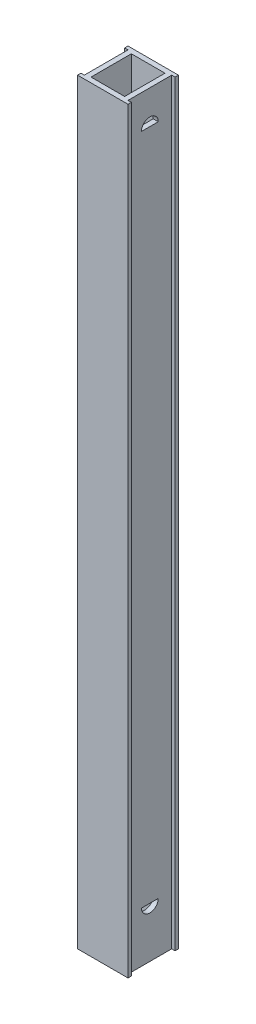
ISO-10303-21;
HEADER;
FILE_DESCRIPTION(('STEP AP214'),'2;1');
FILE_NAME('part.step','',(''),(''),'','','');
FILE_SCHEMA(('AUTOMOTIVE_DESIGN { 1 0 10303 214 1 1 1 1 }'));
ENDSEC;
DATA;
#1=APPLICATION_CONTEXT('core data for automotive mechanical design processes');
#2=APPLICATION_PROTOCOL_DEFINITION('international standard','automotive_design',2000,#1);
#3=PRODUCT_CONTEXT('',#1,'mechanical');
#4=PRODUCT('Part','Part','',(#3));
#5=PRODUCT_RELATED_PRODUCT_CATEGORY('part','',(#4));
#6=PRODUCT_DEFINITION_FORMATION('','',#4);
#7=PRODUCT_DEFINITION_CONTEXT('part definition',#1,'design');
#8=PRODUCT_DEFINITION('design','',#6,#7);
#9=PRODUCT_DEFINITION_SHAPE('','',#8);
#10=(LENGTH_UNIT() NAMED_UNIT(*) SI_UNIT(.MILLI.,.METRE.));
#11=(NAMED_UNIT(*) PLANE_ANGLE_UNIT() SI_UNIT($,.RADIAN.));
#12=(NAMED_UNIT(*) SI_UNIT($,.STERADIAN.) SOLID_ANGLE_UNIT());
#13=UNCERTAINTY_MEASURE_WITH_UNIT(LENGTH_MEASURE(1.E-05),#10,'distance_accuracy_value','');
#14=(GEOMETRIC_REPRESENTATION_CONTEXT(3) GLOBAL_UNCERTAINTY_ASSIGNED_CONTEXT((#13)) GLOBAL_UNIT_ASSIGNED_CONTEXT((#10,
#11,#12)) REPRESENTATION_CONTEXT('',''));
#15=CARTESIAN_POINT('',(0.,0.,0.));
#16=DIRECTION('',(0.,0.,1.));
#17=DIRECTION('',(1.,0.,0.));
#18=AXIS2_PLACEMENT_3D('',#15,#16,#17);
#19=CARTESIAN_POINT('',(-15.,225.,30.));
#20=DIRECTION('',(0.,-1.,0.));
#21=DIRECTION('',(0.,0.,-1.));
#22=AXIS2_PLACEMENT_3D('',#19,#20,#21);
#23=PLANE('',#22);
#24=DIRECTION('',(0.,0.,-1.));
#25=VECTOR('',#24,1.);
#26=CARTESIAN_POINT('',(-15.,225.,30.));
#27=LINE('',#26,#25);
#28=CARTESIAN_POINT('',(-15.,225.,2.));
#29=VERTEX_POINT('',#28);
#30=CARTESIAN_POINT('',(-15.,225.,0.));
#31=VERTEX_POINT('',#30);
#32=EDGE_CURVE('E349',#29,#31,#27,.T.);
#33=ORIENTED_EDGE('',*,*,#32,.F.);
#34=DIRECTION('',(-1.,0.,0.));
#35=VECTOR('',#34,1.);
#36=CARTESIAN_POINT('',(-15.,225.,2.));
#37=LINE('',#36,#35);
#38=CARTESIAN_POINT('',(-13.,225.,2.));
#39=VERTEX_POINT('',#38);
#40=EDGE_CURVE('E291',#39,#29,#37,.T.);
#41=ORIENTED_EDGE('',*,*,#40,.F.);
#42=DIRECTION('',(0.,0.,-1.));
#43=VECTOR('',#42,1.);
#44=CARTESIAN_POINT('',(-13.,225.,2.));
#45=LINE('',#44,#43);
#46=CARTESIAN_POINT('',(-13.,225.,28.));
#47=VERTEX_POINT('',#46);
#48=EDGE_CURVE('E301',#47,#39,#45,.T.);
#49=ORIENTED_EDGE('',*,*,#48,.F.);
#50=DIRECTION('',(1.,0.,0.));
#51=VECTOR('',#50,1.);
#52=CARTESIAN_POINT('',(-13.,225.,28.));
#53=LINE('',#52,#51);
#54=CARTESIAN_POINT('',(-15.,225.,28.));
#55=VERTEX_POINT('',#54);
#56=EDGE_CURVE('E298',#55,#47,#53,.T.);
#57=ORIENTED_EDGE('',*,*,#56,.F.);
#58=CARTESIAN_POINT('',(-15.,225.,30.));
#59=VERTEX_POINT('',#58);
#60=EDGE_CURVE('E360',#59,#55,#27,.T.);
#61=ORIENTED_EDGE('',*,*,#60,.F.);
#62=DIRECTION('',(-1.,0.,0.));
#63=VECTOR('',#62,1.);
#64=CARTESIAN_POINT('',(-15.,225.,30.));
#65=LINE('',#64,#63);
#66=CARTESIAN_POINT('',(15.,225.,30.));
#67=VERTEX_POINT('',#66);
#68=EDGE_CURVE('E347',#67,#59,#65,.T.);
#69=ORIENTED_EDGE('',*,*,#68,.F.);
#70=DIRECTION('',(0.,0.,-1.));
#71=VECTOR('',#70,1.);
#72=CARTESIAN_POINT('',(15.,225.,30.));
#73=LINE('',#72,#71);
#74=CARTESIAN_POINT('',(15.,225.,28.));
#75=VERTEX_POINT('',#74);
#76=EDGE_CURVE('E364',#67,#75,#73,.T.);
#77=ORIENTED_EDGE('',*,*,#76,.T.);
#78=DIRECTION('',(1.,0.,0.));
#79=VECTOR('',#78,1.);
#80=CARTESIAN_POINT('',(13.,225.,28.));
#81=LINE('',#80,#79);
#82=CARTESIAN_POINT('',(13.,225.,28.));
#83=VERTEX_POINT('',#82);
#84=EDGE_CURVE('E328',#83,#75,#81,.T.);
#85=ORIENTED_EDGE('',*,*,#84,.F.);
#86=DIRECTION('',(0.,0.,1.));
#87=VECTOR('',#86,1.);
#88=CARTESIAN_POINT('',(13.,225.,2.));
#89=LINE('',#88,#87);
#90=CARTESIAN_POINT('',(13.,225.,2.));
#91=VERTEX_POINT('',#90);
#92=EDGE_CURVE('E302',#91,#83,#89,.T.);
#93=ORIENTED_EDGE('',*,*,#92,.F.);
#94=DIRECTION('',(-1.,0.,0.));
#95=VECTOR('',#94,1.);
#96=CARTESIAN_POINT('',(15.,225.,2.));
#97=LINE('',#96,#95);
#98=CARTESIAN_POINT('',(15.,225.,2.));
#99=VERTEX_POINT('',#98);
#100=EDGE_CURVE('E325',#99,#91,#97,.T.);
#101=ORIENTED_EDGE('',*,*,#100,.F.);
#102=CARTESIAN_POINT('',(15.,225.,0.));
#103=VERTEX_POINT('',#102);
#104=EDGE_CURVE('E363',#99,#103,#73,.T.);
#105=ORIENTED_EDGE('',*,*,#104,.T.);
#106=DIRECTION('',(-1.,0.,0.));
#107=VECTOR('',#106,1.);
#108=CARTESIAN_POINT('',(-15.,225.,0.));
#109=LINE('',#108,#107);
#110=EDGE_CURVE('E343',#103,#31,#109,.T.);
#111=ORIENTED_EDGE('',*,*,#110,.T.);
#112=EDGE_LOOP('',(#33,#41,#49,#57,#61,#69,#77,#85,#93,#101,#105,#111));
#113=FACE_BOUND('',#112,.T.);
#114=DIRECTION('',(-1.,0.,0.));
#115=VECTOR('',#114,1.);
#116=CARTESIAN_POINT('',(-15.,225.,3.));
#117=LINE('',#116,#115);
#118=CARTESIAN_POINT('',(10.,225.,3.));
#119=VERTEX_POINT('',#118);
#120=CARTESIAN_POINT('',(-10.,225.,3.));
#121=VERTEX_POINT('',#120);
#122=EDGE_CURVE('E256',#119,#121,#117,.T.);
#123=ORIENTED_EDGE('',*,*,#122,.F.);
#124=DIRECTION('',(0.,0.,1.));
#125=VECTOR('',#124,1.);
#126=CARTESIAN_POINT('',(10.,225.,2.));
#127=LINE('',#126,#125);
#128=CARTESIAN_POINT('',(10.,225.,27.));
#129=VERTEX_POINT('',#128);
#130=EDGE_CURVE('E260',#119,#129,#127,.T.);
#131=ORIENTED_EDGE('',*,*,#130,.T.);
#132=DIRECTION('',(-1.,0.,0.));
#133=VECTOR('',#132,1.);
#134=CARTESIAN_POINT('',(-15.,225.,27.));
#135=LINE('',#134,#133);
#136=CARTESIAN_POINT('',(-10.,225.,27.));
#137=VERTEX_POINT('',#136);
#138=EDGE_CURVE('E264',#129,#137,#135,.T.);
#139=ORIENTED_EDGE('',*,*,#138,.T.);
#140=DIRECTION('',(0.,0.,-1.));
#141=VECTOR('',#140,1.);
#142=CARTESIAN_POINT('',(-10.,225.,2.));
#143=LINE('',#142,#141);
#144=EDGE_CURVE('E267',#137,#121,#143,.T.);
#145=ORIENTED_EDGE('',*,*,#144,.T.);
#146=EDGE_LOOP('',(#123,#131,#139,#145));
#147=FACE_BOUND('',#146,.T.);
#148=ADVANCED_FACE('F41',(#113,#147),#23,.F.);
#149=CARTESIAN_POINT('',(-15.,225.,30.));
#150=DIRECTION('',(1.,0.,0.));
#151=DIRECTION('',(0.,0.,-1.));
#152=AXIS2_PLACEMENT_3D('',#149,#150,#151);
#153=PLANE('',#152);
#154=DIRECTION('',(0.,0.,-1.));
#155=VECTOR('',#154,1.);
#156=CARTESIAN_POINT('',(-15.,-225.,30.));
#157=LINE('',#156,#155);
#158=CARTESIAN_POINT('',(-15.,-225.,2.));
#159=VERTEX_POINT('',#158);
#160=CARTESIAN_POINT('',(-15.,-225.,0.));
#161=VERTEX_POINT('',#160);
#162=EDGE_CURVE('E371',#159,#161,#157,.T.);
#163=ORIENTED_EDGE('',*,*,#162,.F.);
#164=DIRECTION('',(0.,1.,0.));
#165=VECTOR('',#164,1.);
#166=CARTESIAN_POINT('',(-15.,-225.,2.));
#167=LINE('',#166,#165);
#168=EDGE_CURVE('E306',#159,#29,#167,.T.);
#169=ORIENTED_EDGE('',*,*,#168,.T.);
#170=ORIENTED_EDGE('',*,*,#32,.T.);
#171=DIRECTION('',(0.,-1.,0.));
#172=VECTOR('',#171,1.);
#173=CARTESIAN_POINT('',(-15.,225.,0.));
#174=LINE('',#173,#172);
#175=EDGE_CURVE('E309',#31,#161,#174,.T.);
#176=ORIENTED_EDGE('',*,*,#175,.T.);
#177=EDGE_LOOP('',(#163,#169,#170,#176));
#178=FACE_BOUND('',#177,.T.);
#179=ADVANCED_FACE('F426',(#178),#153,.F.);
#180=CARTESIAN_POINT('',(15.,-225.,30.));
#181=DIRECTION('',(-1.,0.,0.));
#182=DIRECTION('',(0.,0.,1.));
#183=AXIS2_PLACEMENT_3D('',#180,#181,#182);
#184=PLANE('',#183);
#185=ORIENTED_EDGE('',*,*,#104,.F.);
#186=DIRECTION('',(0.,1.,0.));
#187=VECTOR('',#186,1.);
#188=CARTESIAN_POINT('',(15.,-225.,2.));
#189=LINE('',#188,#187);
#190=CARTESIAN_POINT('',(15.,-225.,2.));
#191=VERTEX_POINT('',#190);
#192=EDGE_CURVE('E322',#191,#99,#189,.T.);
#193=ORIENTED_EDGE('',*,*,#192,.F.);
#194=DIRECTION('',(0.,0.,-1.));
#195=VECTOR('',#194,1.);
#196=CARTESIAN_POINT('',(15.,-225.,30.));
#197=LINE('',#196,#195);
#198=CARTESIAN_POINT('',(15.,-225.,0.));
#199=VERTEX_POINT('',#198);
#200=EDGE_CURVE('E367',#191,#199,#197,.T.);
#201=ORIENTED_EDGE('',*,*,#200,.T.);
#202=DIRECTION('',(0.,1.,0.));
#203=VECTOR('',#202,1.);
#204=CARTESIAN_POINT('',(15.,-225.,0.));
#205=LINE('',#204,#203);
#206=EDGE_CURVE('E355',#199,#103,#205,.T.);
#207=ORIENTED_EDGE('',*,*,#206,.T.);
#208=EDGE_LOOP('',(#185,#193,#201,#207));
#209=FACE_BOUND('',#208,.T.);
#210=ADVANCED_FACE('F434',(#209),#184,.F.);
#211=ORIENTED_EDGE('',*,*,#60,.T.);
#212=DIRECTION('',(0.,1.,0.));
#213=VECTOR('',#212,1.);
#214=CARTESIAN_POINT('',(-15.,-225.,28.));
#215=LINE('',#214,#213);
#216=CARTESIAN_POINT('',(-15.,-225.,28.));
#217=VERTEX_POINT('',#216);
#218=EDGE_CURVE('E297',#217,#55,#215,.T.);
#219=ORIENTED_EDGE('',*,*,#218,.F.);
#220=CARTESIAN_POINT('',(-15.,-225.,30.));
#221=VERTEX_POINT('',#220);
#222=EDGE_CURVE('E372',#221,#217,#157,.T.);
#223=ORIENTED_EDGE('',*,*,#222,.F.);
#224=DIRECTION('',(0.,-1.,0.));
#225=VECTOR('',#224,1.);
#226=CARTESIAN_POINT('',(-15.,225.,30.));
#227=LINE('',#226,#225);
#228=EDGE_CURVE('E339',#59,#221,#227,.T.);
#229=ORIENTED_EDGE('',*,*,#228,.F.);
#230=EDGE_LOOP('',(#211,#219,#223,#229));
#231=FACE_BOUND('',#230,.T.);
#232=ADVANCED_FACE('F43',(#231),#153,.F.);
#233=CARTESIAN_POINT('',(-15.,-225.,30.));
#234=DIRECTION('',(0.,1.,0.));
#235=DIRECTION('',(0.,0.,1.));
#236=AXIS2_PLACEMENT_3D('',#233,#234,#235);
#237=PLANE('',#236);
#238=DIRECTION('',(0.,0.,-1.));
#239=VECTOR('',#238,1.);
#240=CARTESIAN_POINT('',(-10.,-225.,30.));
#241=LINE('',#240,#239);
#242=CARTESIAN_POINT('',(-10.,-225.,27.));
#243=VERTEX_POINT('',#242);
#244=CARTESIAN_POINT('',(-10.,-225.,3.));
#245=VERTEX_POINT('',#244);
#246=EDGE_CURVE('E257',#243,#245,#241,.T.);
#247=ORIENTED_EDGE('',*,*,#246,.F.);
#248=DIRECTION('',(1.,0.,0.));
#249=VECTOR('',#248,1.);
#250=CARTESIAN_POINT('',(-15.,-225.,27.));
#251=LINE('',#250,#249);
#252=CARTESIAN_POINT('',(10.,-225.,27.));
#253=VERTEX_POINT('',#252);
#254=EDGE_CURVE('E261',#243,#253,#251,.T.);
#255=ORIENTED_EDGE('',*,*,#254,.T.);
#256=DIRECTION('',(0.,0.,1.));
#257=VECTOR('',#256,1.);
#258=CARTESIAN_POINT('',(10.,-225.,30.));
#259=LINE('',#258,#257);
#260=CARTESIAN_POINT('',(10.,-225.,3.));
#261=VERTEX_POINT('',#260);
#262=EDGE_CURVE('E253',#261,#253,#259,.T.);
#263=ORIENTED_EDGE('',*,*,#262,.F.);
#264=DIRECTION('',(1.,0.,0.));
#265=VECTOR('',#264,1.);
#266=CARTESIAN_POINT('',(-15.,-225.,3.));
#267=LINE('',#266,#265);
#268=EDGE_CURVE('E254',#245,#261,#267,.T.);
#269=ORIENTED_EDGE('',*,*,#268,.F.);
#270=EDGE_LOOP('',(#247,#255,#263,#269));
#271=FACE_BOUND('',#270,.T.);
#272=DIRECTION('',(0.,0.,-1.));
#273=VECTOR('',#272,1.);
#274=CARTESIAN_POINT('',(-13.,-225.,2.));
#275=LINE('',#274,#273);
#276=CARTESIAN_POINT('',(-13.,-225.,28.));
#277=VERTEX_POINT('',#276);
#278=CARTESIAN_POINT('',(-13.,-225.,2.));
#279=VERTEX_POINT('',#278);
#280=EDGE_CURVE('E290',#277,#279,#275,.T.);
#281=ORIENTED_EDGE('',*,*,#280,.T.);
#282=DIRECTION('',(-1.,0.,0.));
#283=VECTOR('',#282,1.);
#284=CARTESIAN_POINT('',(-15.,-225.,2.));
#285=LINE('',#284,#283);
#286=EDGE_CURVE('E294',#279,#159,#285,.T.);
#287=ORIENTED_EDGE('',*,*,#286,.T.);
#288=ORIENTED_EDGE('',*,*,#162,.T.);
#289=DIRECTION('',(1.,0.,0.));
#290=VECTOR('',#289,1.);
#291=CARTESIAN_POINT('',(-15.,-225.,0.));
#292=LINE('',#291,#290);
#293=EDGE_CURVE('E352',#161,#199,#292,.T.);
#294=ORIENTED_EDGE('',*,*,#293,.T.);
#295=ORIENTED_EDGE('',*,*,#200,.F.);
#296=DIRECTION('',(-1.,0.,0.));
#297=VECTOR('',#296,1.);
#298=CARTESIAN_POINT('',(15.,-225.,2.));
#299=LINE('',#298,#297);
#300=CARTESIAN_POINT('',(13.,-225.,2.));
#301=VERTEX_POINT('',#300);
#302=EDGE_CURVE('E318',#191,#301,#299,.T.);
#303=ORIENTED_EDGE('',*,*,#302,.T.);
#304=DIRECTION('',(0.,0.,1.));
#305=VECTOR('',#304,1.);
#306=CARTESIAN_POINT('',(13.,-225.,2.));
#307=LINE('',#306,#305);
#308=CARTESIAN_POINT('',(13.,-225.,28.));
#309=VERTEX_POINT('',#308);
#310=EDGE_CURVE('E329',#301,#309,#307,.T.);
#311=ORIENTED_EDGE('',*,*,#310,.T.);
#312=DIRECTION('',(1.,0.,0.));
#313=VECTOR('',#312,1.);
#314=CARTESIAN_POINT('',(13.,-225.,28.));
#315=LINE('',#314,#313);
#316=CARTESIAN_POINT('',(15.,-225.,28.));
#317=VERTEX_POINT('',#316);
#318=EDGE_CURVE('E334',#309,#317,#315,.T.);
#319=ORIENTED_EDGE('',*,*,#318,.T.);
#320=CARTESIAN_POINT('',(15.,-225.,30.));
#321=VERTEX_POINT('',#320);
#322=EDGE_CURVE('E368',#321,#317,#197,.T.);
#323=ORIENTED_EDGE('',*,*,#322,.F.);
#324=DIRECTION('',(1.,0.,0.));
#325=VECTOR('',#324,1.);
#326=CARTESIAN_POINT('',(-15.,-225.,30.));
#327=LINE('',#326,#325);
#328=EDGE_CURVE('E342',#221,#321,#327,.T.);
#329=ORIENTED_EDGE('',*,*,#328,.F.);
#330=ORIENTED_EDGE('',*,*,#222,.T.);
#331=DIRECTION('',(1.,0.,0.));
#332=VECTOR('',#331,1.);
#333=CARTESIAN_POINT('',(-13.,-225.,28.));
#334=LINE('',#333,#332);
#335=EDGE_CURVE('E287',#217,#277,#334,.T.);
#336=ORIENTED_EDGE('',*,*,#335,.T.);
#337=EDGE_LOOP('',(#281,#287,#288,#294,#295,#303,#311,#319,#323,#329,#330,#336));
#338=FACE_BOUND('',#337,.T.);
#339=ADVANCED_FACE('F410',(#271,#338),#237,.F.);
#340=ORIENTED_EDGE('',*,*,#322,.T.);
#341=DIRECTION('',(0.,1.,0.));
#342=VECTOR('',#341,1.);
#343=CARTESIAN_POINT('',(15.,-225.,28.));
#344=LINE('',#343,#342);
#345=EDGE_CURVE('E319',#317,#75,#344,.T.);
#346=ORIENTED_EDGE('',*,*,#345,.T.);
#347=ORIENTED_EDGE('',*,*,#76,.F.);
#348=DIRECTION('',(0.,1.,0.));
#349=VECTOR('',#348,1.);
#350=CARTESIAN_POINT('',(15.,-225.,30.));
#351=LINE('',#350,#349);
#352=EDGE_CURVE('E345',#321,#67,#351,.T.);
#353=ORIENTED_EDGE('',*,*,#352,.F.);
#354=EDGE_LOOP('',(#340,#346,#347,#353));
#355=FACE_BOUND('',#354,.T.);
#356=ADVANCED_FACE('F441',(#355),#184,.F.);
#357=CARTESIAN_POINT('',(0.,0.,30.));
#358=DIRECTION('',(0.,0.,1.));
#359=DIRECTION('',(1.,0.,0.));
#360=AXIS2_PLACEMENT_3D('',#357,#358,#359);
#361=PLANE('',#360);
#362=ORIENTED_EDGE('',*,*,#228,.T.);
#363=ORIENTED_EDGE('',*,*,#328,.T.);
#364=ORIENTED_EDGE('',*,*,#352,.T.);
#365=ORIENTED_EDGE('',*,*,#68,.T.);
#366=EDGE_LOOP('',(#362,#363,#364,#365));
#367=FACE_BOUND('',#366,.T.);
#368=ADVANCED_FACE('F443',(#367),#361,.T.);
#369=CARTESIAN_POINT('',(0.,0.,0.));
#370=DIRECTION('',(0.,0.,1.));
#371=DIRECTION('',(1.,0.,0.));
#372=AXIS2_PLACEMENT_3D('',#369,#370,#371);
#373=PLANE('',#372);
#374=ORIENTED_EDGE('',*,*,#175,.F.);
#375=ORIENTED_EDGE('',*,*,#110,.F.);
#376=ORIENTED_EDGE('',*,*,#206,.F.);
#377=ORIENTED_EDGE('',*,*,#293,.F.);
#378=EDGE_LOOP('',(#374,#375,#376,#377));
#379=FACE_BOUND('',#378,.T.);
#380=ADVANCED_FACE('F439',(#379),#373,.F.);
#381=CARTESIAN_POINT('',(13.,-225.,2.));
#382=DIRECTION('',(-1.,0.,0.));
#383=DIRECTION('',(0.,0.,1.));
#384=AXIS2_PLACEMENT_3D('',#381,#382,#383);
#385=PLANE('',#384);
#386=DIRECTION('',(0.,0.,-1.));
#387=VECTOR('',#386,1.);
#388=CARTESIAN_POINT('',(13.,205.,20.0000000000001));
#389=LINE('',#388,#387);
#390=CARTESIAN_POINT('',(13.,205.,20.0000000000001));
#391=VERTEX_POINT('',#390);
#392=CARTESIAN_POINT('',(13.,205.,10.0000000000001));
#393=VERTEX_POINT('',#392);
#394=EDGE_CURVE('E213',#391,#393,#389,.T.);
#395=ORIENTED_EDGE('',*,*,#394,.F.);
#396=CARTESIAN_POINT('',(13.,205.,15.0000000000001));
#397=DIRECTION('',(1.,0.,0.));
#398=DIRECTION('',(0.,0.,-1.));
#399=AXIS2_PLACEMENT_3D('',#396,#397,#398);
#400=CIRCLE('',#399,5.);
#401=EDGE_CURVE('E56',#393,#391,#400,.T.);
#402=ORIENTED_EDGE('',*,*,#401,.F.);
#403=EDGE_LOOP('',(#395,#402));
#404=FACE_BOUND('',#403,.T.);
#405=DIRECTION('',(0.,0.,1.));
#406=VECTOR('',#405,1.);
#407=CARTESIAN_POINT('',(13.,-195.,20.));
#408=LINE('',#407,#406);
#409=CARTESIAN_POINT('',(13.,-195.,10.));
#410=VERTEX_POINT('',#409);
#411=CARTESIAN_POINT('',(13.,-195.,20.));
#412=VERTEX_POINT('',#411);
#413=EDGE_CURVE('E221',#410,#412,#408,.T.);
#414=ORIENTED_EDGE('',*,*,#413,.F.);
#415=CARTESIAN_POINT('',(13.,-195.,15.));
#416=DIRECTION('',(1.,0.,0.));
#417=DIRECTION('',(0.,0.,1.));
#418=AXIS2_PLACEMENT_3D('',#415,#416,#417);
#419=CIRCLE('',#418,5.);
#420=EDGE_CURVE('E64',#412,#410,#419,.T.);
#421=ORIENTED_EDGE('',*,*,#420,.F.);
#422=EDGE_LOOP('',(#414,#421));
#423=FACE_BOUND('',#422,.T.);
#424=ORIENTED_EDGE('',*,*,#92,.T.);
#425=DIRECTION('',(0.,1.,0.));
#426=VECTOR('',#425,1.);
#427=CARTESIAN_POINT('',(13.,-225.,28.));
#428=LINE('',#427,#426);
#429=EDGE_CURVE('E315',#309,#83,#428,.T.);
#430=ORIENTED_EDGE('',*,*,#429,.F.);
#431=ORIENTED_EDGE('',*,*,#310,.F.);
#432=DIRECTION('',(0.,1.,0.));
#433=VECTOR('',#432,1.);
#434=CARTESIAN_POINT('',(13.,-225.,2.));
#435=LINE('',#434,#433);
#436=EDGE_CURVE('E286',#301,#91,#435,.T.);
#437=ORIENTED_EDGE('',*,*,#436,.T.);
#438=EDGE_LOOP('',(#424,#430,#431,#437));
#439=FACE_BOUND('',#438,.T.);
#440=ADVANCED_FACE('F218',(#404,#423,#439),#385,.F.);
#441=CARTESIAN_POINT('',(15.,-225.,2.));
#442=DIRECTION('',(0.,0.,-1.));
#443=DIRECTION('',(-1.,0.,0.));
#444=AXIS2_PLACEMENT_3D('',#441,#442,#443);
#445=PLANE('',#444);
#446=ORIENTED_EDGE('',*,*,#100,.T.);
#447=ORIENTED_EDGE('',*,*,#436,.F.);
#448=ORIENTED_EDGE('',*,*,#302,.F.);
#449=ORIENTED_EDGE('',*,*,#192,.T.);
#450=EDGE_LOOP('',(#446,#447,#448,#449));
#451=FACE_BOUND('',#450,.T.);
#452=ADVANCED_FACE('F476',(#451),#445,.F.);
#453=CARTESIAN_POINT('',(13.,-225.,28.));
#454=DIRECTION('',(0.,0.,1.));
#455=DIRECTION('',(1.,0.,0.));
#456=AXIS2_PLACEMENT_3D('',#453,#454,#455);
#457=PLANE('',#456);
#458=ORIENTED_EDGE('',*,*,#84,.T.);
#459=ORIENTED_EDGE('',*,*,#345,.F.);
#460=ORIENTED_EDGE('',*,*,#318,.F.);
#461=ORIENTED_EDGE('',*,*,#429,.T.);
#462=EDGE_LOOP('',(#458,#459,#460,#461));
#463=FACE_BOUND('',#462,.T.);
#464=ADVANCED_FACE('F471',(#463),#457,.F.);
#465=CARTESIAN_POINT('',(-15.,-225.,2.));
#466=DIRECTION('',(0.,0.,-1.));
#467=DIRECTION('',(-1.,0.,0.));
#468=AXIS2_PLACEMENT_3D('',#465,#466,#467);
#469=PLANE('',#468);
#470=ORIENTED_EDGE('',*,*,#40,.T.);
#471=ORIENTED_EDGE('',*,*,#168,.F.);
#472=ORIENTED_EDGE('',*,*,#286,.F.);
#473=DIRECTION('',(0.,1.,0.));
#474=VECTOR('',#473,1.);
#475=CARTESIAN_POINT('',(-13.,-225.,2.));
#476=LINE('',#475,#474);
#477=EDGE_CURVE('E310',#279,#39,#476,.T.);
#478=ORIENTED_EDGE('',*,*,#477,.T.);
#479=EDGE_LOOP('',(#470,#471,#472,#478));
#480=FACE_BOUND('',#479,.T.);
#481=ADVANCED_FACE('F488',(#480),#469,.F.);
#482=CARTESIAN_POINT('',(-13.,-225.,2.));
#483=DIRECTION('',(1.,0.,0.));
#484=DIRECTION('',(0.,0.,-1.));
#485=AXIS2_PLACEMENT_3D('',#482,#483,#484);
#486=PLANE('',#485);
#487=DIRECTION('',(0.,0.,-1.));
#488=VECTOR('',#487,1.);
#489=CARTESIAN_POINT('',(-13.,205.,2.));
#490=LINE('',#489,#488);
#491=CARTESIAN_POINT('',(-13.,205.,20.));
#492=VERTEX_POINT('',#491);
#493=CARTESIAN_POINT('',(-13.,205.,10.));
#494=VERTEX_POINT('',#493);
#495=EDGE_CURVE('E246',#492,#494,#490,.T.);
#496=ORIENTED_EDGE('',*,*,#495,.T.);
#497=CARTESIAN_POINT('',(-13.,205.,15.));
#498=DIRECTION('',(1.,0.,0.));
#499=DIRECTION('',(0.,0.,-1.));
#500=AXIS2_PLACEMENT_3D('',#497,#498,#499);
#501=CIRCLE('',#500,5.);
#502=EDGE_CURVE('E250',#494,#492,#501,.T.);
#503=ORIENTED_EDGE('',*,*,#502,.T.);
#504=EDGE_LOOP('',(#496,#503));
#505=FACE_BOUND('',#504,.T.);
#506=DIRECTION('',(0.,0.,1.));
#507=VECTOR('',#506,1.);
#508=CARTESIAN_POINT('',(-13.,-195.,2.));
#509=LINE('',#508,#507);
#510=CARTESIAN_POINT('',(-13.,-195.,10.));
#511=VERTEX_POINT('',#510);
#512=CARTESIAN_POINT('',(-13.,-195.,20.));
#513=VERTEX_POINT('',#512);
#514=EDGE_CURVE('E235',#511,#513,#509,.T.);
#515=ORIENTED_EDGE('',*,*,#514,.T.);
#516=CARTESIAN_POINT('',(-13.,-195.,15.));
#517=DIRECTION('',(1.,0.,0.));
#518=DIRECTION('',(0.,0.,-1.));
#519=AXIS2_PLACEMENT_3D('',#516,#517,#518);
#520=CIRCLE('',#519,5.);
#521=EDGE_CURVE('E241',#513,#511,#520,.T.);
#522=ORIENTED_EDGE('',*,*,#521,.T.);
#523=EDGE_LOOP('',(#515,#522));
#524=FACE_BOUND('',#523,.T.);
#525=ORIENTED_EDGE('',*,*,#48,.T.);
#526=ORIENTED_EDGE('',*,*,#477,.F.);
#527=ORIENTED_EDGE('',*,*,#280,.F.);
#528=DIRECTION('',(0.,1.,0.));
#529=VECTOR('',#528,1.);
#530=CARTESIAN_POINT('',(-13.,-225.,28.));
#531=LINE('',#530,#529);
#532=EDGE_CURVE('E312',#277,#47,#531,.T.);
#533=ORIENTED_EDGE('',*,*,#532,.T.);
#534=EDGE_LOOP('',(#525,#526,#527,#533));
#535=FACE_BOUND('',#534,.T.);
#536=ADVANCED_FACE('F490',(#505,#524,#535),#486,.F.);
#537=CARTESIAN_POINT('',(-13.,-225.,28.));
#538=DIRECTION('',(0.,0.,1.));
#539=DIRECTION('',(1.,0.,0.));
#540=AXIS2_PLACEMENT_3D('',#537,#538,#539);
#541=PLANE('',#540);
#542=ORIENTED_EDGE('',*,*,#56,.T.);
#543=ORIENTED_EDGE('',*,*,#532,.F.);
#544=ORIENTED_EDGE('',*,*,#335,.F.);
#545=ORIENTED_EDGE('',*,*,#218,.T.);
#546=EDGE_LOOP('',(#542,#543,#544,#545));
#547=FACE_BOUND('',#546,.T.);
#548=ADVANCED_FACE('F423',(#547),#541,.F.);
#549=CARTESIAN_POINT('',(0.,0.,27.));
#550=DIRECTION('',(0.,0.,1.));
#551=DIRECTION('',(1.,0.,0.));
#552=AXIS2_PLACEMENT_3D('',#549,#550,#551);
#553=PLANE('',#552);
#554=ORIENTED_EDGE('',*,*,#254,.F.);
#555=DIRECTION('',(0.,1.,0.));
#556=VECTOR('',#555,1.);
#557=CARTESIAN_POINT('',(-10.,0.,27.));
#558=LINE('',#557,#556);
#559=EDGE_CURVE('E272',#243,#137,#558,.T.);
#560=ORIENTED_EDGE('',*,*,#559,.T.);
#561=ORIENTED_EDGE('',*,*,#138,.F.);
#562=DIRECTION('',(0.,1.,0.));
#563=VECTOR('',#562,1.);
#564=CARTESIAN_POINT('',(10.,-225.,27.));
#565=LINE('',#564,#563);
#566=EDGE_CURVE('E280',#253,#129,#565,.T.);
#567=ORIENTED_EDGE('',*,*,#566,.F.);
#568=EDGE_LOOP('',(#554,#560,#561,#567));
#569=FACE_BOUND('',#568,.T.);
#570=ADVANCED_FACE('F404',(#569),#553,.F.);
#571=CARTESIAN_POINT('',(0.,0.,3.));
#572=DIRECTION('',(0.,0.,1.));
#573=DIRECTION('',(1.,0.,0.));
#574=AXIS2_PLACEMENT_3D('',#571,#572,#573);
#575=PLANE('',#574);
#576=ORIENTED_EDGE('',*,*,#122,.T.);
#577=DIRECTION('',(0.,-1.,0.));
#578=VECTOR('',#577,1.);
#579=CARTESIAN_POINT('',(-10.,-225.,3.));
#580=LINE('',#579,#578);
#581=EDGE_CURVE('E278',#121,#245,#580,.T.);
#582=ORIENTED_EDGE('',*,*,#581,.T.);
#583=ORIENTED_EDGE('',*,*,#268,.T.);
#584=DIRECTION('',(0.,-1.,0.));
#585=VECTOR('',#584,1.);
#586=CARTESIAN_POINT('',(10.,0.,3.));
#587=LINE('',#586,#585);
#588=EDGE_CURVE('E283',#119,#261,#587,.T.);
#589=ORIENTED_EDGE('',*,*,#588,.F.);
#590=EDGE_LOOP('',(#576,#582,#583,#589));
#591=FACE_BOUND('',#590,.T.);
#592=ADVANCED_FACE('F413',(#591),#575,.T.);
#593=CARTESIAN_POINT('',(10.,-225.,2.));
#594=DIRECTION('',(-1.,0.,0.));
#595=DIRECTION('',(0.,0.,1.));
#596=AXIS2_PLACEMENT_3D('',#593,#594,#595);
#597=PLANE('',#596);
#598=CARTESIAN_POINT('',(10.,205.,15.0000000000001));
#599=DIRECTION('',(-1.,0.,0.));
#600=DIRECTION('',(0.,0.,1.));
#601=AXIS2_PLACEMENT_3D('',#598,#599,#600);
#602=CIRCLE('',#601,5.);
#603=CARTESIAN_POINT('',(10.,205.,20.0000000000001));
#604=VERTEX_POINT('',#603);
#605=CARTESIAN_POINT('',(10.,205.,10.));
#606=VERTEX_POINT('',#605);
#607=EDGE_CURVE('E206',#604,#606,#602,.T.);
#608=ORIENTED_EDGE('',*,*,#607,.F.);
#609=DIRECTION('',(0.,0.,1.));
#610=VECTOR('',#609,1.);
#611=CARTESIAN_POINT('',(10.,205.,2.));
#612=LINE('',#611,#610);
#613=EDGE_CURVE('E244',#606,#604,#612,.T.);
#614=ORIENTED_EDGE('',*,*,#613,.F.);
#615=EDGE_LOOP('',(#608,#614));
#616=FACE_BOUND('',#615,.T.);
#617=CARTESIAN_POINT('',(10.,-195.,15.));
#618=DIRECTION('',(-1.,0.,0.));
#619=DIRECTION('',(0.,0.,1.));
#620=AXIS2_PLACEMENT_3D('',#617,#618,#619);
#621=CIRCLE('',#620,5.);
#622=CARTESIAN_POINT('',(10.,-195.,10.));
#623=VERTEX_POINT('',#622);
#624=CARTESIAN_POINT('',(10.,-195.,20.));
#625=VERTEX_POINT('',#624);
#626=EDGE_CURVE('E238',#623,#625,#621,.T.);
#627=ORIENTED_EDGE('',*,*,#626,.F.);
#628=DIRECTION('',(0.,0.,-1.));
#629=VECTOR('',#628,1.);
#630=CARTESIAN_POINT('',(10.,-195.,2.));
#631=LINE('',#630,#629);
#632=EDGE_CURVE('E233',#625,#623,#631,.T.);
#633=ORIENTED_EDGE('',*,*,#632,.F.);
#634=EDGE_LOOP('',(#627,#633));
#635=FACE_BOUND('',#634,.T.);
#636=ORIENTED_EDGE('',*,*,#588,.T.);
#637=ORIENTED_EDGE('',*,*,#262,.T.);
#638=ORIENTED_EDGE('',*,*,#566,.T.);
#639=ORIENTED_EDGE('',*,*,#130,.F.);
#640=EDGE_LOOP('',(#636,#637,#638,#639));
#641=FACE_BOUND('',#640,.T.);
#642=ADVANCED_FACE('F393',(#616,#635,#641),#597,.T.);
#643=CARTESIAN_POINT('',(-10.,-225.,2.));
#644=DIRECTION('',(1.,0.,0.));
#645=DIRECTION('',(0.,0.,-1.));
#646=AXIS2_PLACEMENT_3D('',#643,#644,#645);
#647=PLANE('',#646);
#648=CARTESIAN_POINT('',(-10.,205.,15.));
#649=DIRECTION('',(1.,0.,0.));
#650=DIRECTION('',(0.,0.,-1.));
#651=AXIS2_PLACEMENT_3D('',#648,#649,#650);
#652=CIRCLE('',#651,5.);
#653=CARTESIAN_POINT('',(-10.,205.,10.));
#654=VERTEX_POINT('',#653);
#655=CARTESIAN_POINT('',(-10.,205.,20.0000000000001));
#656=VERTEX_POINT('',#655);
#657=EDGE_CURVE('E11',#654,#656,#652,.T.);
#658=ORIENTED_EDGE('',*,*,#657,.F.);
#659=DIRECTION('',(0.,0.,-1.));
#660=VECTOR('',#659,1.);
#661=CARTESIAN_POINT('',(-10.,205.,2.));
#662=LINE('',#661,#660);
#663=EDGE_CURVE('E49',#656,#654,#662,.T.);
#664=ORIENTED_EDGE('',*,*,#663,.F.);
#665=EDGE_LOOP('',(#658,#664));
#666=FACE_BOUND('',#665,.T.);
#667=CARTESIAN_POINT('',(-10.,-195.,15.));
#668=DIRECTION('',(1.,0.,0.));
#669=DIRECTION('',(0.,0.,-1.));
#670=AXIS2_PLACEMENT_3D('',#667,#668,#669);
#671=CIRCLE('',#670,5.);
#672=CARTESIAN_POINT('',(-10.,-195.,20.));
#673=VERTEX_POINT('',#672);
#674=CARTESIAN_POINT('',(-10.,-195.,10.));
#675=VERTEX_POINT('',#674);
#676=EDGE_CURVE('E377',#673,#675,#671,.T.);
#677=ORIENTED_EDGE('',*,*,#676,.F.);
#678=DIRECTION('',(0.,0.,1.));
#679=VECTOR('',#678,1.);
#680=CARTESIAN_POINT('',(-10.,-195.,2.));
#681=LINE('',#680,#679);
#682=EDGE_CURVE('E375',#675,#673,#681,.T.);
#683=ORIENTED_EDGE('',*,*,#682,.F.);
#684=EDGE_LOOP('',(#677,#683));
#685=FACE_BOUND('',#684,.T.);
#686=ORIENTED_EDGE('',*,*,#144,.F.);
#687=ORIENTED_EDGE('',*,*,#559,.F.);
#688=ORIENTED_EDGE('',*,*,#246,.T.);
#689=ORIENTED_EDGE('',*,*,#581,.F.);
#690=EDGE_LOOP('',(#686,#687,#688,#689));
#691=FACE_BOUND('',#690,.T.);
#692=ADVANCED_FACE('F389',(#666,#685,#691),#647,.T.);
#693=CARTESIAN_POINT('',(-15.,-195.,20.));
#694=DIRECTION('',(0.,1.,0.));
#695=DIRECTION('',(0.,0.,1.));
#696=AXIS2_PLACEMENT_3D('',#693,#694,#695);
#697=PLANE('',#696);
#698=DIRECTION('',(1.,0.,0.));
#699=VECTOR('',#698,1.);
#700=CARTESIAN_POINT('',(-15.,-195.,10.));
#701=LINE('',#700,#699);
#702=EDGE_CURVE('E227',#511,#675,#701,.T.);
#703=ORIENTED_EDGE('',*,*,#702,.T.);
#704=ORIENTED_EDGE('',*,*,#682,.T.);
#705=DIRECTION('',(1.,0.,0.));
#706=VECTOR('',#705,1.);
#707=CARTESIAN_POINT('',(-15.,-195.,20.));
#708=LINE('',#707,#706);
#709=EDGE_CURVE('E228',#513,#673,#708,.T.);
#710=ORIENTED_EDGE('',*,*,#709,.F.);
#711=ORIENTED_EDGE('',*,*,#514,.F.);
#712=EDGE_LOOP('',(#703,#704,#710,#711));
#713=FACE_BOUND('',#712,.T.);
#714=ADVANCED_FACE('F392',(#713),#697,.F.);
#715=CARTESIAN_POINT('',(-15.,-195.,15.));
#716=DIRECTION('',(1.,0.,0.));
#717=DIRECTION('',(0.,0.,-1.));
#718=AXIS2_PLACEMENT_3D('',#715,#716,#717);
#719=CYLINDRICAL_SURFACE('',#718,5.);
#720=ORIENTED_EDGE('',*,*,#709,.T.);
#721=ORIENTED_EDGE('',*,*,#676,.T.);
#722=ORIENTED_EDGE('',*,*,#702,.F.);
#723=ORIENTED_EDGE('',*,*,#521,.F.);
#724=EDGE_LOOP('',(#720,#721,#722,#723));
#725=FACE_BOUND('',#724,.T.);
#726=ADVANCED_FACE('F601',(#725),#719,.F.);
#727=CARTESIAN_POINT('',(-15.,205.,20.));
#728=DIRECTION('',(0.,-1.,0.));
#729=DIRECTION('',(0.,0.,-1.));
#730=AXIS2_PLACEMENT_3D('',#727,#728,#729);
#731=PLANE('',#730);
#732=DIRECTION('',(1.,0.,0.));
#733=VECTOR('',#732,1.);
#734=CARTESIAN_POINT('',(-15.,205.,20.));
#735=LINE('',#734,#733);
#736=EDGE_CURVE('E210',#492,#656,#735,.T.);
#737=ORIENTED_EDGE('',*,*,#736,.T.);
#738=ORIENTED_EDGE('',*,*,#663,.T.);
#739=DIRECTION('',(1.,0.,0.));
#740=VECTOR('',#739,1.);
#741=CARTESIAN_POINT('',(-15.,205.,10.));
#742=LINE('',#741,#740);
#743=EDGE_CURVE('E209',#494,#654,#742,.T.);
#744=ORIENTED_EDGE('',*,*,#743,.F.);
#745=ORIENTED_EDGE('',*,*,#495,.F.);
#746=EDGE_LOOP('',(#737,#738,#744,#745));
#747=FACE_BOUND('',#746,.T.);
#748=ADVANCED_FACE('F382',(#747),#731,.F.);
#749=CARTESIAN_POINT('',(-15.,205.,15.));
#750=DIRECTION('',(1.,0.,0.));
#751=DIRECTION('',(0.,0.,-1.));
#752=AXIS2_PLACEMENT_3D('',#749,#750,#751);
#753=CYLINDRICAL_SURFACE('',#752,5.);
#754=ORIENTED_EDGE('',*,*,#743,.T.);
#755=ORIENTED_EDGE('',*,*,#657,.T.);
#756=ORIENTED_EDGE('',*,*,#736,.F.);
#757=ORIENTED_EDGE('',*,*,#502,.F.);
#758=EDGE_LOOP('',(#754,#755,#756,#757));
#759=FACE_BOUND('',#758,.T.);
#760=ADVANCED_FACE('F388',(#759),#753,.F.);
#761=ORIENTED_EDGE('',*,*,#626,.T.);
#762=EDGE_CURVE('E229',#625,#412,#708,.T.);
#763=ORIENTED_EDGE('',*,*,#762,.T.);
#764=ORIENTED_EDGE('',*,*,#420,.T.);
#765=EDGE_CURVE('E225',#623,#410,#701,.T.);
#766=ORIENTED_EDGE('',*,*,#765,.F.);
#767=EDGE_LOOP('',(#761,#763,#764,#766));
#768=FACE_BOUND('',#767,.T.);
#769=ADVANCED_FACE('F614',(#768),#719,.F.);
#770=ORIENTED_EDGE('',*,*,#632,.T.);
#771=ORIENTED_EDGE('',*,*,#765,.T.);
#772=ORIENTED_EDGE('',*,*,#413,.T.);
#773=ORIENTED_EDGE('',*,*,#762,.F.);
#774=EDGE_LOOP('',(#770,#771,#772,#773));
#775=FACE_BOUND('',#774,.T.);
#776=ADVANCED_FACE('F604',(#775),#697,.F.);
#777=ORIENTED_EDGE('',*,*,#607,.T.);
#778=EDGE_CURVE('E202',#606,#393,#742,.T.);
#779=ORIENTED_EDGE('',*,*,#778,.T.);
#780=ORIENTED_EDGE('',*,*,#401,.T.);
#781=EDGE_CURVE('E215',#604,#391,#735,.T.);
#782=ORIENTED_EDGE('',*,*,#781,.F.);
#783=EDGE_LOOP('',(#777,#779,#780,#782));
#784=FACE_BOUND('',#783,.T.);
#785=ADVANCED_FACE('F204',(#784),#753,.F.);
#786=ORIENTED_EDGE('',*,*,#613,.T.);
#787=ORIENTED_EDGE('',*,*,#781,.T.);
#788=ORIENTED_EDGE('',*,*,#394,.T.);
#789=ORIENTED_EDGE('',*,*,#778,.F.);
#790=EDGE_LOOP('',(#786,#787,#788,#789));
#791=FACE_BOUND('',#790,.T.);
#792=ADVANCED_FACE('F214',(#791),#731,.F.);
#793=CLOSED_SHELL('',(#148,#179,#210,#232,#339,#356,#368,#380,#440,#452,#464,#481,#536,#548,
#570,#592,#642,#692,#714,#726,#748,#760,#769,#776,#785,#792));
#794=MANIFOLD_SOLID_BREP('B2',#793);
#795=ADVANCED_BREP_SHAPE_REPRESENTATION('',(#18,#794),#14);
#796=SHAPE_DEFINITION_REPRESENTATION(#9,#795);
ENDSEC;
END-ISO-10303-21;
